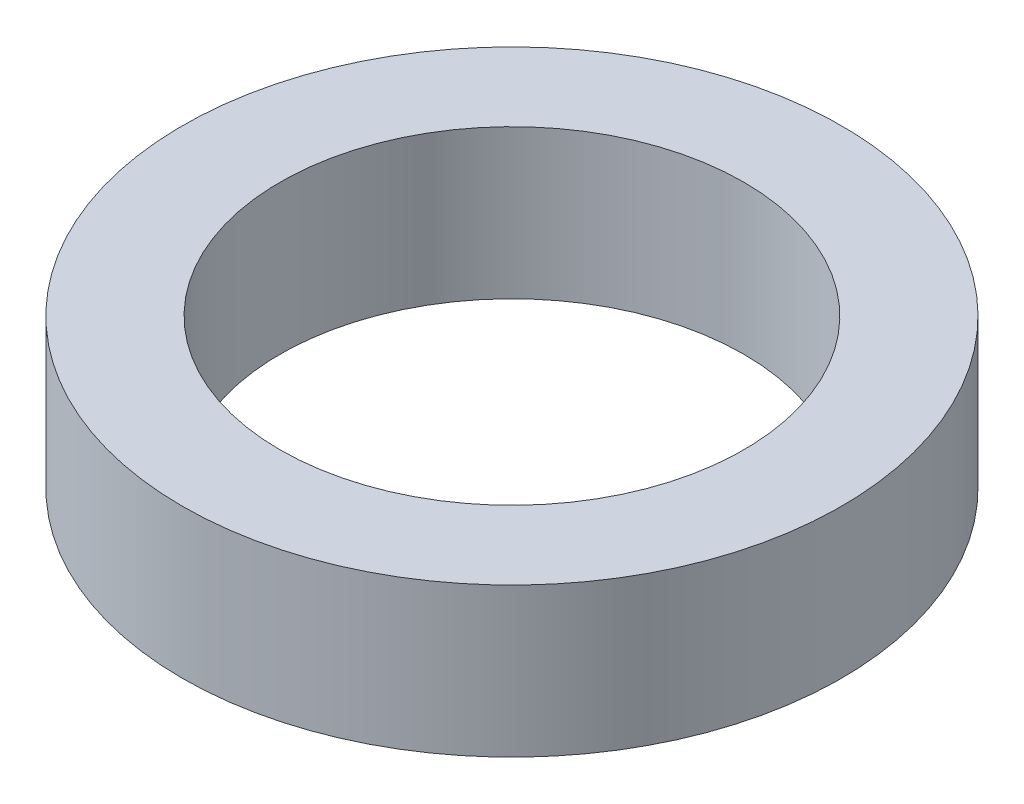
ISO-10303-21;
HEADER;
FILE_DESCRIPTION(('STEP AP214'),'2;1');
FILE_NAME('part.step','',(''),(''),'','','');
FILE_SCHEMA(('AUTOMOTIVE_DESIGN { 1 0 10303 214 1 1 1 1 }'));
ENDSEC;
DATA;
#1=APPLICATION_CONTEXT('core data for automotive mechanical design processes');
#2=APPLICATION_PROTOCOL_DEFINITION('international standard','automotive_design',2000,#1);
#3=PRODUCT_CONTEXT('',#1,'mechanical');
#4=PRODUCT('Part','Part','',(#3));
#5=PRODUCT_RELATED_PRODUCT_CATEGORY('part','',(#4));
#6=PRODUCT_DEFINITION_FORMATION('','',#4);
#7=PRODUCT_DEFINITION_CONTEXT('part definition',#1,'design');
#8=PRODUCT_DEFINITION('design','',#6,#7);
#9=PRODUCT_DEFINITION_SHAPE('','',#8);
#10=(LENGTH_UNIT() NAMED_UNIT(*) SI_UNIT(.MILLI.,.METRE.));
#11=(NAMED_UNIT(*) PLANE_ANGLE_UNIT() SI_UNIT($,.RADIAN.));
#12=(NAMED_UNIT(*) SI_UNIT($,.STERADIAN.) SOLID_ANGLE_UNIT());
#13=UNCERTAINTY_MEASURE_WITH_UNIT(LENGTH_MEASURE(1.E-05),#10,'distance_accuracy_value','');
#14=(GEOMETRIC_REPRESENTATION_CONTEXT(3) GLOBAL_UNCERTAINTY_ASSIGNED_CONTEXT((#13)) GLOBAL_UNIT_ASSIGNED_CONTEXT((#10,
#11,#12)) REPRESENTATION_CONTEXT('',''));
#15=CARTESIAN_POINT('',(0.,0.,0.));
#16=DIRECTION('',(0.,0.,1.));
#17=DIRECTION('',(1.,0.,0.));
#18=AXIS2_PLACEMENT_3D('',#15,#16,#17);
#19=CARTESIAN_POINT('',(0.,2.25,0.));
#20=DIRECTION('',(0.,1.,0.));
#21=DIRECTION('',(0.,0.,1.));
#22=AXIS2_PLACEMENT_3D('',#19,#20,#21);
#23=PLANE('',#22);
#24=CARTESIAN_POINT('',(0.,2.25,0.));
#25=DIRECTION('',(0.,1.,0.));
#26=DIRECTION('',(0.,0.,1.));
#27=AXIS2_PLACEMENT_3D('',#24,#25,#26);
#28=CIRCLE('',#27,4.975);
#29=CARTESIAN_POINT('',(0.,2.25,4.975));
#30=VERTEX_POINT('',#29);
#31=EDGE_CURVE('E10',#30,#30,#28,.T.);
#32=ORIENTED_EDGE('',*,*,#31,.T.);
#33=EDGE_LOOP('',(#32));
#34=FACE_BOUND('',#33,.T.);
#35=CARTESIAN_POINT('',(0.,2.25,0.));
#36=DIRECTION('',(0.,1.,0.));
#37=DIRECTION('',(0.,0.,1.));
#38=AXIS2_PLACEMENT_3D('',#35,#36,#37);
#39=CIRCLE('',#38,3.5);
#40=CARTESIAN_POINT('',(0.,2.25,3.5));
#41=VERTEX_POINT('',#40);
#42=EDGE_CURVE('E42',#41,#41,#39,.T.);
#43=ORIENTED_EDGE('',*,*,#42,.F.);
#44=EDGE_LOOP('',(#43));
#45=FACE_BOUND('',#44,.T.);
#46=ADVANCED_FACE('F31',(#34,#45),#23,.T.);
#47=CARTESIAN_POINT('',(0.,0.,0.));
#48=DIRECTION('',(0.,1.,0.));
#49=DIRECTION('',(0.,0.,1.));
#50=AXIS2_PLACEMENT_3D('',#47,#48,#49);
#51=PLANE('',#50);
#52=CARTESIAN_POINT('',(0.,0.,0.));
#53=DIRECTION('',(0.,1.,0.));
#54=DIRECTION('',(0.,0.,1.));
#55=AXIS2_PLACEMENT_3D('',#52,#53,#54);
#56=CIRCLE('',#55,4.975);
#57=CARTESIAN_POINT('',(0.,0.,4.975));
#58=VERTEX_POINT('',#57);
#59=EDGE_CURVE('E35',#58,#58,#56,.T.);
#60=ORIENTED_EDGE('',*,*,#59,.F.);
#61=EDGE_LOOP('',(#60));
#62=FACE_BOUND('',#61,.T.);
#63=CARTESIAN_POINT('',(0.,0.,0.));
#64=DIRECTION('',(0.,1.,0.));
#65=DIRECTION('',(0.,0.,1.));
#66=AXIS2_PLACEMENT_3D('',#63,#64,#65);
#67=CIRCLE('',#66,3.5);
#68=CARTESIAN_POINT('',(0.,0.,3.5));
#69=VERTEX_POINT('',#68);
#70=EDGE_CURVE('E44',#69,#69,#67,.T.);
#71=ORIENTED_EDGE('',*,*,#70,.T.);
#72=EDGE_LOOP('',(#71));
#73=FACE_BOUND('',#72,.T.);
#74=ADVANCED_FACE('F54',(#62,#73),#51,.F.);
#75=CARTESIAN_POINT('',(0.,2.25,0.));
#76=DIRECTION('',(0.,-1.,0.));
#77=DIRECTION('',(0.,0.,-1.));
#78=AXIS2_PLACEMENT_3D('',#75,#76,#77);
#79=CYLINDRICAL_SURFACE('',#78,4.975);
#80=ORIENTED_EDGE('',*,*,#31,.F.);
#81=EDGE_LOOP('',(#80));
#82=FACE_BOUND('',#81,.T.);
#83=ORIENTED_EDGE('',*,*,#59,.T.);
#84=EDGE_LOOP('',(#83));
#85=FACE_BOUND('',#84,.T.);
#86=ADVANCED_FACE('F33',(#82,#85),#79,.T.);
#87=CARTESIAN_POINT('',(0.,2.25,0.));
#88=DIRECTION('',(0.,-1.,0.));
#89=DIRECTION('',(0.,0.,-1.));
#90=AXIS2_PLACEMENT_3D('',#87,#88,#89);
#91=CYLINDRICAL_SURFACE('',#90,3.5);
#92=ORIENTED_EDGE('',*,*,#42,.T.);
#93=EDGE_LOOP('',(#92));
#94=FACE_BOUND('',#93,.T.);
#95=ORIENTED_EDGE('',*,*,#70,.F.);
#96=EDGE_LOOP('',(#95));
#97=FACE_BOUND('',#96,.T.);
#98=ADVANCED_FACE('F50',(#94,#97),#91,.F.);
#99=CLOSED_SHELL('',(#46,#74,#86,#98));
#100=MANIFOLD_SOLID_BREP('B2',#99);
#101=ADVANCED_BREP_SHAPE_REPRESENTATION('',(#18,#100),#14);
#102=SHAPE_DEFINITION_REPRESENTATION(#9,#101);
ENDSEC;
END-ISO-10303-21;
